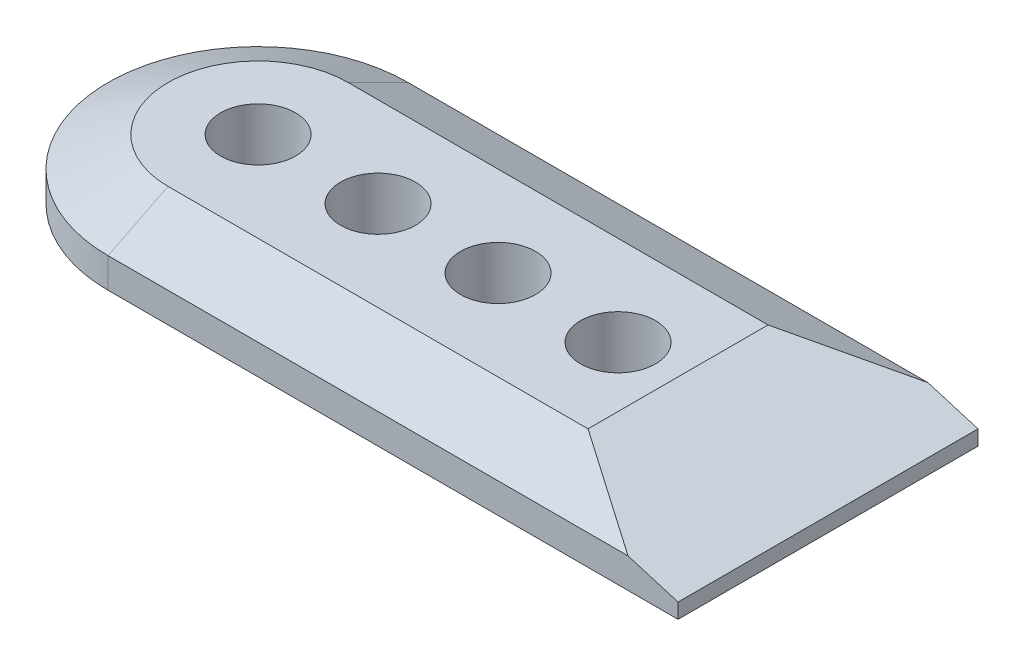
ISO-10303-21;
HEADER;
FILE_DESCRIPTION(('STEP AP214'),'2;1');
FILE_NAME('part.step','',(''),(''),'','','');
FILE_SCHEMA(('AUTOMOTIVE_DESIGN { 1 0 10303 214 1 1 1 1 }'));
ENDSEC;
DATA;
#1=APPLICATION_CONTEXT('core data for automotive mechanical design processes');
#2=APPLICATION_PROTOCOL_DEFINITION('international standard','automotive_design',2000,#1);
#3=PRODUCT_CONTEXT('',#1,'mechanical');
#4=PRODUCT('Part','Part','',(#3));
#5=PRODUCT_RELATED_PRODUCT_CATEGORY('part','',(#4));
#6=PRODUCT_DEFINITION_FORMATION('','',#4);
#7=PRODUCT_DEFINITION_CONTEXT('part definition',#1,'design');
#8=PRODUCT_DEFINITION('design','',#6,#7);
#9=PRODUCT_DEFINITION_SHAPE('','',#8);
#10=(LENGTH_UNIT() NAMED_UNIT(*) SI_UNIT(.MILLI.,.METRE.));
#11=(NAMED_UNIT(*) PLANE_ANGLE_UNIT() SI_UNIT($,.RADIAN.));
#12=(NAMED_UNIT(*) SI_UNIT($,.STERADIAN.) SOLID_ANGLE_UNIT());
#13=UNCERTAINTY_MEASURE_WITH_UNIT(LENGTH_MEASURE(1.E-05),#10,'distance_accuracy_value','');
#14=(GEOMETRIC_REPRESENTATION_CONTEXT(3) GLOBAL_UNCERTAINTY_ASSIGNED_CONTEXT((#13)) GLOBAL_UNIT_ASSIGNED_CONTEXT((#10,
#11,#12)) REPRESENTATION_CONTEXT('',''));
#15=CARTESIAN_POINT('',(0.,0.,0.));
#16=DIRECTION('',(0.,0.,1.));
#17=DIRECTION('',(1.,0.,0.));
#18=AXIS2_PLACEMENT_3D('',#15,#16,#17);
#19=CARTESIAN_POINT('',(0.,12.7,0.));
#20=DIRECTION('',(0.,-1.,0.));
#21=DIRECTION('',(0.,0.,-1.));
#22=AXIS2_PLACEMENT_3D('',#19,#20,#21);
#23=CYLINDRICAL_SURFACE('',#22,31.75);
#24=DIRECTION('',(0.,-1.,0.));
#25=VECTOR('',#24,1.);
#26=CARTESIAN_POINT('',(0.,12.7,31.75));
#27=LINE('',#26,#25);
#28=CARTESIAN_POINT('',(0.,6.34999999999998,31.75));
#29=VERTEX_POINT('',#28);
#30=CARTESIAN_POINT('',(0.,0.,31.75));
#31=VERTEX_POINT('',#30);
#32=EDGE_CURVE('E108',#29,#31,#27,.T.);
#33=ORIENTED_EDGE('',*,*,#32,.F.);
#34=CARTESIAN_POINT('',(0.,6.34999999999998,0.));
#35=DIRECTION('',(0.,1.,0.));
#36=DIRECTION('',(0.,0.,1.));
#37=AXIS2_PLACEMENT_3D('',#34,#35,#36);
#38=CIRCLE('',#37,31.75);
#39=CARTESIAN_POINT('',(0.,6.34999999999998,-31.75));
#40=VERTEX_POINT('',#39);
#41=EDGE_CURVE('E169',#29,#40,#38,.F.);
#42=ORIENTED_EDGE('',*,*,#41,.T.);
#43=DIRECTION('',(0.,-1.,0.));
#44=VECTOR('',#43,1.);
#45=CARTESIAN_POINT('',(0.,12.7,-31.75));
#46=LINE('',#45,#44);
#47=CARTESIAN_POINT('',(0.,0.,-31.75));
#48=VERTEX_POINT('',#47);
#49=EDGE_CURVE('E131',#40,#48,#46,.T.);
#50=ORIENTED_EDGE('',*,*,#49,.T.);
#51=CARTESIAN_POINT('',(0.,0.,0.));
#52=DIRECTION('',(0.,1.,0.));
#53=DIRECTION('',(0.,0.,1.));
#54=AXIS2_PLACEMENT_3D('',#51,#52,#53);
#55=CIRCLE('',#54,31.75);
#56=EDGE_CURVE('E125',#48,#31,#55,.T.);
#57=ORIENTED_EDGE('',*,*,#56,.T.);
#58=EDGE_LOOP('',(#33,#42,#50,#57));
#59=FACE_BOUND('',#58,.T.);
#60=ADVANCED_FACE('F49',(#59),#23,.T.);
#61=CARTESIAN_POINT('',(120.65,12.7,31.75));
#62=DIRECTION('',(0.,0.,-1.));
#63=DIRECTION('',(-1.,0.,0.));
#64=AXIS2_PLACEMENT_3D('',#61,#62,#63);
#65=PLANE('',#64);
#66=DIRECTION('',(0.,-1.,0.));
#67=VECTOR('',#66,1.);
#68=CARTESIAN_POINT('',(120.65,12.7,31.75));
#69=LINE('',#68,#67);
#70=CARTESIAN_POINT('',(120.65,3.175,31.75));
#71=VERTEX_POINT('',#70);
#72=CARTESIAN_POINT('',(120.65,0.,31.75));
#73=VERTEX_POINT('',#72);
#74=EDGE_CURVE('E119',#71,#73,#69,.T.);
#75=ORIENTED_EDGE('',*,*,#74,.F.);
#76=DIRECTION('',(-0.957826285221152,0.287347885566343,0.));
#77=VECTOR('',#76,1.);
#78=CARTESIAN_POINT('',(88.8999999999997,12.7,31.75));
#79=LINE('',#78,#77);
#80=CARTESIAN_POINT('',(110.066666666667,6.34999999999998,31.75));
#81=VERTEX_POINT('',#80);
#82=EDGE_CURVE('E59',#71,#81,#79,.T.);
#83=ORIENTED_EDGE('',*,*,#82,.T.);
#84=DIRECTION('',(-1.,0.,0.));
#85=VECTOR('',#84,1.);
#86=CARTESIAN_POINT('',(0.,6.34999999999998,31.75));
#87=LINE('',#86,#85);
#88=EDGE_CURVE('E113',#81,#29,#87,.T.);
#89=ORIENTED_EDGE('',*,*,#88,.T.);
#90=ORIENTED_EDGE('',*,*,#32,.T.);
#91=DIRECTION('',(1.,0.,0.));
#92=VECTOR('',#91,1.);
#93=CARTESIAN_POINT('',(120.65,0.,31.75));
#94=LINE('',#93,#92);
#95=EDGE_CURVE('E111',#31,#73,#94,.T.);
#96=ORIENTED_EDGE('',*,*,#95,.T.);
#97=EDGE_LOOP('',(#75,#83,#89,#90,#96));
#98=FACE_BOUND('',#97,.T.);
#99=ADVANCED_FACE('F110',(#98),#65,.F.);
#100=CARTESIAN_POINT('',(120.65,12.7,-31.75));
#101=DIRECTION('',(-1.,0.,0.));
#102=DIRECTION('',(0.,0.,1.));
#103=AXIS2_PLACEMENT_3D('',#100,#101,#102);
#104=PLANE('',#103);
#105=DIRECTION('',(0.,-1.,0.));
#106=VECTOR('',#105,1.);
#107=CARTESIAN_POINT('',(120.65,12.7,-31.75));
#108=LINE('',#107,#106);
#109=CARTESIAN_POINT('',(120.65,3.175,-31.75));
#110=VERTEX_POINT('',#109);
#111=CARTESIAN_POINT('',(120.65,0.,-31.75));
#112=VERTEX_POINT('',#111);
#113=EDGE_CURVE('E151',#110,#112,#108,.T.);
#114=ORIENTED_EDGE('',*,*,#113,.F.);
#115=DIRECTION('',(0.,0.,1.));
#116=VECTOR('',#115,1.);
#117=CARTESIAN_POINT('',(120.65,3.175,19.0499999999999));
#118=LINE('',#117,#116);
#119=EDGE_CURVE('E73',#110,#71,#118,.T.);
#120=ORIENTED_EDGE('',*,*,#119,.T.);
#121=ORIENTED_EDGE('',*,*,#74,.T.);
#122=DIRECTION('',(0.,0.,-1.));
#123=VECTOR('',#122,1.);
#124=CARTESIAN_POINT('',(120.65,0.,-31.75));
#125=LINE('',#124,#123);
#126=EDGE_CURVE('E127',#73,#112,#125,.T.);
#127=ORIENTED_EDGE('',*,*,#126,.T.);
#128=EDGE_LOOP('',(#114,#120,#121,#127));
#129=FACE_BOUND('',#128,.T.);
#130=ADVANCED_FACE('F195',(#129),#104,.F.);
#131=CARTESIAN_POINT('',(0.,12.7,-31.75));
#132=DIRECTION('',(0.,0.,1.));
#133=DIRECTION('',(1.,0.,0.));
#134=AXIS2_PLACEMENT_3D('',#131,#132,#133);
#135=PLANE('',#134);
#136=DIRECTION('',(1.,0.,0.));
#137=VECTOR('',#136,1.);
#138=CARTESIAN_POINT('',(120.65,6.34999999999998,-31.75));
#139=LINE('',#138,#137);
#140=CARTESIAN_POINT('',(110.066666666667,6.34999999999998,-31.75));
#141=VERTEX_POINT('',#140);
#142=EDGE_CURVE('E165',#40,#141,#139,.T.);
#143=ORIENTED_EDGE('',*,*,#142,.T.);
#144=DIRECTION('',(0.957826285221152,-0.287347885566343,0.));
#145=VECTOR('',#144,1.);
#146=CARTESIAN_POINT('',(88.8999999999997,12.7,-31.75));
#147=LINE('',#146,#145);
#148=EDGE_CURVE('E185',#141,#110,#147,.T.);
#149=ORIENTED_EDGE('',*,*,#148,.T.);
#150=ORIENTED_EDGE('',*,*,#113,.T.);
#151=DIRECTION('',(-1.,0.,0.));
#152=VECTOR('',#151,1.);
#153=CARTESIAN_POINT('',(0.,0.,-31.75));
#154=LINE('',#153,#152);
#155=EDGE_CURVE('E146',#112,#48,#154,.T.);
#156=ORIENTED_EDGE('',*,*,#155,.T.);
#157=ORIENTED_EDGE('',*,*,#49,.F.);
#158=EDGE_LOOP('',(#143,#149,#150,#156,#157));
#159=FACE_BOUND('',#158,.T.);
#160=ADVANCED_FACE('F192',(#159),#135,.F.);
#161=CARTESIAN_POINT('',(0.,12.7,0.));
#162=DIRECTION('',(0.,1.,0.));
#163=DIRECTION('',(0.,0.,1.));
#164=AXIS2_PLACEMENT_3D('',#161,#162,#163);
#165=PLANE('',#164);
#166=CARTESIAN_POINT('',(0.,12.7,0.));
#167=DIRECTION('',(0.,1.,0.));
#168=DIRECTION('',(0.,0.,1.));
#169=AXIS2_PLACEMENT_3D('',#166,#167,#168);
#170=CIRCLE('',#169,7.9375);
#171=CARTESIAN_POINT('',(0.,12.7,7.9375));
#172=VERTEX_POINT('',#171);
#173=EDGE_CURVE('E259',#172,#172,#170,.T.);
#174=ORIENTED_EDGE('',*,*,#173,.F.);
#175=EDGE_LOOP('',(#174));
#176=FACE_BOUND('',#175,.T.);
#177=CARTESIAN_POINT('',(25.4,12.7,0.));
#178=DIRECTION('',(0.,1.,0.));
#179=DIRECTION('',(0.,0.,1.));
#180=AXIS2_PLACEMENT_3D('',#177,#178,#179);
#181=CIRCLE('',#180,7.9375);
#182=CARTESIAN_POINT('',(25.4,12.7,7.9375));
#183=VERTEX_POINT('',#182);
#184=EDGE_CURVE('E261',#183,#183,#181,.T.);
#185=ORIENTED_EDGE('',*,*,#184,.F.);
#186=EDGE_LOOP('',(#185));
#187=FACE_BOUND('',#186,.T.);
#188=CARTESIAN_POINT('',(50.8,12.7,0.));
#189=DIRECTION('',(0.,1.,0.));
#190=DIRECTION('',(0.,0.,1.));
#191=AXIS2_PLACEMENT_3D('',#188,#189,#190);
#192=CIRCLE('',#191,7.9375);
#193=CARTESIAN_POINT('',(50.8,12.7,7.9375));
#194=VERTEX_POINT('',#193);
#195=EDGE_CURVE('E273',#194,#194,#192,.T.);
#196=ORIENTED_EDGE('',*,*,#195,.F.);
#197=EDGE_LOOP('',(#196));
#198=FACE_BOUND('',#197,.T.);
#199=CARTESIAN_POINT('',(76.2,12.7,0.));
#200=DIRECTION('',(0.,1.,0.));
#201=DIRECTION('',(0.,0.,1.));
#202=AXIS2_PLACEMENT_3D('',#199,#200,#201);
#203=CIRCLE('',#202,7.93749999999999);
#204=CARTESIAN_POINT('',(76.2,12.7,7.93749999999999));
#205=VERTEX_POINT('',#204);
#206=EDGE_CURVE('E280',#205,#205,#203,.T.);
#207=ORIENTED_EDGE('',*,*,#206,.F.);
#208=EDGE_LOOP('',(#207));
#209=FACE_BOUND('',#208,.T.);
#210=DIRECTION('',(1.,0.,0.));
#211=VECTOR('',#210,1.);
#212=CARTESIAN_POINT('',(120.65,12.7,19.0499999999999));
#213=LINE('',#212,#211);
#214=CARTESIAN_POINT('',(0.,12.7,19.0499999999999));
#215=VERTEX_POINT('',#214);
#216=CARTESIAN_POINT('',(88.8999999999997,12.7,19.0499999999999));
#217=VERTEX_POINT('',#216);
#218=EDGE_CURVE('E118',#215,#217,#213,.T.);
#219=ORIENTED_EDGE('',*,*,#218,.T.);
#220=DIRECTION('',(0.,0.,-1.));
#221=VECTOR('',#220,1.);
#222=CARTESIAN_POINT('',(88.8999999999997,12.7,-19.0499999999999));
#223=LINE('',#222,#221);
#224=CARTESIAN_POINT('',(88.8999999999997,12.7,-19.0499999999999));
#225=VERTEX_POINT('',#224);
#226=EDGE_CURVE('E174',#217,#225,#223,.T.);
#227=ORIENTED_EDGE('',*,*,#226,.T.);
#228=DIRECTION('',(-1.,0.,0.));
#229=VECTOR('',#228,1.);
#230=CARTESIAN_POINT('',(0.,12.7,-19.0499999999999));
#231=LINE('',#230,#229);
#232=CARTESIAN_POINT('',(0.,12.7,-19.0499999999999));
#233=VERTEX_POINT('',#232);
#234=EDGE_CURVE('E162',#225,#233,#231,.T.);
#235=ORIENTED_EDGE('',*,*,#234,.T.);
#236=CARTESIAN_POINT('',(0.,12.7,0.));
#237=DIRECTION('',(0.,1.,0.));
#238=DIRECTION('',(0.,0.,1.));
#239=AXIS2_PLACEMENT_3D('',#236,#237,#238);
#240=CIRCLE('',#239,19.0499999999999);
#241=EDGE_CURVE('E159',#233,#215,#240,.T.);
#242=ORIENTED_EDGE('',*,*,#241,.T.);
#243=EDGE_LOOP('',(#219,#227,#235,#242));
#244=FACE_BOUND('',#243,.T.);
#245=ADVANCED_FACE('F202',(#176,#187,#198,#209,#244),#165,.T.);
#246=CARTESIAN_POINT('',(0.,0.,0.));
#247=DIRECTION('',(0.,1.,0.));
#248=DIRECTION('',(0.,0.,1.));
#249=AXIS2_PLACEMENT_3D('',#246,#247,#248);
#250=PLANE('',#249);
#251=CARTESIAN_POINT('',(0.,0.,0.));
#252=DIRECTION('',(0.,1.,0.));
#253=DIRECTION('',(0.,0.,1.));
#254=AXIS2_PLACEMENT_3D('',#251,#252,#253);
#255=CIRCLE('',#254,7.9375);
#256=CARTESIAN_POINT('',(0.,0.,7.9375));
#257=VERTEX_POINT('',#256);
#258=EDGE_CURVE('E177',#257,#257,#255,.T.);
#259=ORIENTED_EDGE('',*,*,#258,.T.);
#260=EDGE_LOOP('',(#259));
#261=FACE_BOUND('',#260,.T.);
#262=CARTESIAN_POINT('',(25.4,0.,0.));
#263=DIRECTION('',(0.,1.,0.));
#264=DIRECTION('',(0.,0.,1.));
#265=AXIS2_PLACEMENT_3D('',#262,#263,#264);
#266=CIRCLE('',#265,7.9375);
#267=CARTESIAN_POINT('',(25.4,0.,7.9375));
#268=VERTEX_POINT('',#267);
#269=EDGE_CURVE('E267',#268,#268,#266,.T.);
#270=ORIENTED_EDGE('',*,*,#269,.T.);
#271=EDGE_LOOP('',(#270));
#272=FACE_BOUND('',#271,.T.);
#273=CARTESIAN_POINT('',(50.8,0.,0.));
#274=DIRECTION('',(0.,1.,0.));
#275=DIRECTION('',(0.,0.,1.));
#276=AXIS2_PLACEMENT_3D('',#273,#274,#275);
#277=CIRCLE('',#276,7.9375);
#278=CARTESIAN_POINT('',(50.8,0.,7.9375));
#279=VERTEX_POINT('',#278);
#280=EDGE_CURVE('E277',#279,#279,#277,.T.);
#281=ORIENTED_EDGE('',*,*,#280,.T.);
#282=EDGE_LOOP('',(#281));
#283=FACE_BOUND('',#282,.T.);
#284=CARTESIAN_POINT('',(76.2,0.,0.));
#285=DIRECTION('',(0.,1.,0.));
#286=DIRECTION('',(0.,0.,1.));
#287=AXIS2_PLACEMENT_3D('',#284,#285,#286);
#288=CIRCLE('',#287,7.93749999999999);
#289=CARTESIAN_POINT('',(76.2,0.,7.93749999999999));
#290=VERTEX_POINT('',#289);
#291=EDGE_CURVE('E141',#290,#290,#288,.T.);
#292=ORIENTED_EDGE('',*,*,#291,.T.);
#293=EDGE_LOOP('',(#292));
#294=FACE_BOUND('',#293,.T.);
#295=ORIENTED_EDGE('',*,*,#56,.F.);
#296=ORIENTED_EDGE('',*,*,#155,.F.);
#297=ORIENTED_EDGE('',*,*,#126,.F.);
#298=ORIENTED_EDGE('',*,*,#95,.F.);
#299=EDGE_LOOP('',(#295,#296,#297,#298));
#300=FACE_BOUND('',#299,.T.);
#301=ADVANCED_FACE('F123',(#261,#272,#283,#294,#300),#250,.F.);
#302=CARTESIAN_POINT('',(0.,12.7,19.0499999999999));
#303=DIRECTION('',(0.,0.894427190999917,0.447213595499956));
#304=DIRECTION('',(-1.,0.,0.));
#305=AXIS2_PLACEMENT_3D('',#302,#303,#304);
#306=PLANE('',#305);
#307=ORIENTED_EDGE('',*,*,#88,.F.);
#308=DIRECTION('',(-0.830454798537401,0.249136439561218,-0.498272879122438));
#309=VECTOR('',#308,1.);
#310=CARTESIAN_POINT('',(27.5896551724134,31.0931034482757,-17.7362068965516));
#311=LINE('',#310,#309);
#312=EDGE_CURVE('E11',#81,#217,#311,.T.);
#313=ORIENTED_EDGE('',*,*,#312,.T.);
#314=ORIENTED_EDGE('',*,*,#218,.F.);
#315=DIRECTION('',(0.,0.447213595499956,-0.894427190999917));
#316=VECTOR('',#315,1.);
#317=CARTESIAN_POINT('',(0.,6.34999999999998,31.75));
#318=LINE('',#317,#316);
#319=EDGE_CURVE('E134',#29,#215,#318,.T.);
#320=ORIENTED_EDGE('',*,*,#319,.F.);
#321=EDGE_LOOP('',(#307,#313,#314,#320));
#322=FACE_BOUND('',#321,.T.);
#323=ADVANCED_FACE('F200',(#322),#306,.T.);
#324=CARTESIAN_POINT('',(0.,12.7,0.));
#325=DIRECTION('',(0.,-1.,0.));
#326=DIRECTION('',(0.,0.,-1.));
#327=AXIS2_PLACEMENT_3D('',#324,#325,#326);
#328=CONICAL_SURFACE('',#327,19.0499999999999,1.10714871779409);
#329=ORIENTED_EDGE('',*,*,#319,.T.);
#330=ORIENTED_EDGE('',*,*,#241,.F.);
#331=DIRECTION('',(0.,0.447213595499956,0.894427190999917));
#332=VECTOR('',#331,1.);
#333=CARTESIAN_POINT('',(0.,6.34999999999998,-31.75));
#334=LINE('',#333,#332);
#335=EDGE_CURVE('E138',#40,#233,#334,.T.);
#336=ORIENTED_EDGE('',*,*,#335,.F.);
#337=ORIENTED_EDGE('',*,*,#41,.F.);
#338=EDGE_LOOP('',(#329,#330,#336,#337));
#339=FACE_BOUND('',#338,.T.);
#340=ADVANCED_FACE('F207',(#339),#328,.T.);
#341=CARTESIAN_POINT('',(0.,12.7,-19.0499999999999));
#342=DIRECTION('',(0.,0.894427190999917,-0.447213595499956));
#343=DIRECTION('',(1.,0.,0.));
#344=AXIS2_PLACEMENT_3D('',#341,#342,#343);
#345=PLANE('',#344);
#346=ORIENTED_EDGE('',*,*,#234,.F.);
#347=DIRECTION('',(0.830454798537401,-0.249136439561218,-0.498272879122438));
#348=VECTOR('',#347,1.);
#349=CARTESIAN_POINT('',(27.5896551724134,31.0931034482757,17.7362068965516));
#350=LINE('',#349,#348);
#351=EDGE_CURVE('E182',#225,#141,#350,.T.);
#352=ORIENTED_EDGE('',*,*,#351,.T.);
#353=ORIENTED_EDGE('',*,*,#142,.F.);
#354=ORIENTED_EDGE('',*,*,#335,.T.);
#355=EDGE_LOOP('',(#346,#352,#353,#354));
#356=FACE_BOUND('',#355,.T.);
#357=ADVANCED_FACE('F210',(#356),#345,.T.);
#358=CARTESIAN_POINT('',(88.8999999999997,12.7,0.));
#359=DIRECTION('',(0.287347885566343,0.957826285221152,0.));
#360=DIRECTION('',(0.,0.,1.));
#361=AXIS2_PLACEMENT_3D('',#358,#359,#360);
#362=PLANE('',#361);
#363=ORIENTED_EDGE('',*,*,#82,.F.);
#364=ORIENTED_EDGE('',*,*,#119,.F.);
#365=ORIENTED_EDGE('',*,*,#148,.F.);
#366=ORIENTED_EDGE('',*,*,#351,.F.);
#367=ORIENTED_EDGE('',*,*,#226,.F.);
#368=ORIENTED_EDGE('',*,*,#312,.F.);
#369=EDGE_LOOP('',(#363,#364,#365,#366,#367,#368));
#370=FACE_BOUND('',#369,.T.);
#371=ADVANCED_FACE('F52',(#370),#362,.T.);
#372=CARTESIAN_POINT('',(76.2,0.,0.));
#373=DIRECTION('',(0.,1.,0.));
#374=DIRECTION('',(0.,0.,1.));
#375=AXIS2_PLACEMENT_3D('',#372,#373,#374);
#376=CYLINDRICAL_SURFACE('',#375,7.93749999999999);
#377=ORIENTED_EDGE('',*,*,#291,.F.);
#378=EDGE_LOOP('',(#377));
#379=FACE_BOUND('',#378,.T.);
#380=ORIENTED_EDGE('',*,*,#206,.T.);
#381=EDGE_LOOP('',(#380));
#382=FACE_BOUND('',#381,.T.);
#383=ADVANCED_FACE('F217',(#379,#382),#376,.F.);
#384=CARTESIAN_POINT('',(50.8,0.,0.));
#385=DIRECTION('',(0.,1.,0.));
#386=DIRECTION('',(0.,0.,1.));
#387=AXIS2_PLACEMENT_3D('',#384,#385,#386);
#388=CYLINDRICAL_SURFACE('',#387,7.9375);
#389=ORIENTED_EDGE('',*,*,#280,.F.);
#390=EDGE_LOOP('',(#389));
#391=FACE_BOUND('',#390,.T.);
#392=ORIENTED_EDGE('',*,*,#195,.T.);
#393=EDGE_LOOP('',(#392));
#394=FACE_BOUND('',#393,.T.);
#395=ADVANCED_FACE('F240',(#391,#394),#388,.F.);
#396=CARTESIAN_POINT('',(25.4,0.,0.));
#397=DIRECTION('',(0.,1.,0.));
#398=DIRECTION('',(0.,0.,1.));
#399=AXIS2_PLACEMENT_3D('',#396,#397,#398);
#400=CYLINDRICAL_SURFACE('',#399,7.9375);
#401=ORIENTED_EDGE('',*,*,#269,.F.);
#402=EDGE_LOOP('',(#401));
#403=FACE_BOUND('',#402,.T.);
#404=ORIENTED_EDGE('',*,*,#184,.T.);
#405=EDGE_LOOP('',(#404));
#406=FACE_BOUND('',#405,.T.);
#407=ADVANCED_FACE('F244',(#403,#406),#400,.F.);
#408=CARTESIAN_POINT('',(0.,0.,0.));
#409=DIRECTION('',(0.,1.,0.));
#410=DIRECTION('',(0.,0.,1.));
#411=AXIS2_PLACEMENT_3D('',#408,#409,#410);
#412=CYLINDRICAL_SURFACE('',#411,7.9375);
#413=ORIENTED_EDGE('',*,*,#258,.F.);
#414=EDGE_LOOP('',(#413));
#415=FACE_BOUND('',#414,.T.);
#416=ORIENTED_EDGE('',*,*,#173,.T.);
#417=EDGE_LOOP('',(#416));
#418=FACE_BOUND('',#417,.T.);
#419=ADVANCED_FACE('F248',(#415,#418),#412,.F.);
#420=CLOSED_SHELL('',(#60,#99,#130,#160,#245,#301,#323,#340,#357,#371,#383,#395,#407,#419));
#421=MANIFOLD_SOLID_BREP('B2',#420);
#422=ADVANCED_BREP_SHAPE_REPRESENTATION('',(#18,#421),#14);
#423=SHAPE_DEFINITION_REPRESENTATION(#9,#422);
ENDSEC;
END-ISO-10303-21;
